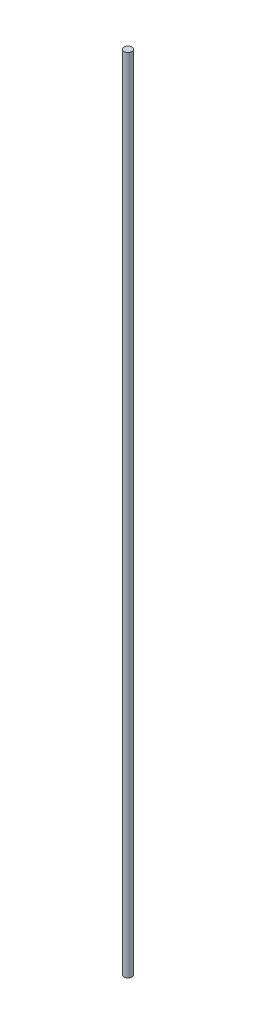
ISO-10303-21;
HEADER;
FILE_DESCRIPTION(('STEP AP214'),'2;1');
FILE_NAME('part.step','',(''),(''),'','','');
FILE_SCHEMA(('AUTOMOTIVE_DESIGN { 1 0 10303 214 1 1 1 1 }'));
ENDSEC;
DATA;
#1=APPLICATION_CONTEXT('core data for automotive mechanical design processes');
#2=APPLICATION_PROTOCOL_DEFINITION('international standard','automotive_design',2000,#1);
#3=PRODUCT_CONTEXT('',#1,'mechanical');
#4=PRODUCT('Part','Part','',(#3));
#5=PRODUCT_RELATED_PRODUCT_CATEGORY('part','',(#4));
#6=PRODUCT_DEFINITION_FORMATION('','',#4);
#7=PRODUCT_DEFINITION_CONTEXT('part definition',#1,'design');
#8=PRODUCT_DEFINITION('design','',#6,#7);
#9=PRODUCT_DEFINITION_SHAPE('','',#8);
#10=(LENGTH_UNIT() NAMED_UNIT(*) SI_UNIT(.MILLI.,.METRE.));
#11=(NAMED_UNIT(*) PLANE_ANGLE_UNIT() SI_UNIT($,.RADIAN.));
#12=(NAMED_UNIT(*) SI_UNIT($,.STERADIAN.) SOLID_ANGLE_UNIT());
#13=UNCERTAINTY_MEASURE_WITH_UNIT(LENGTH_MEASURE(1.E-05),#10,'distance_accuracy_value','');
#14=(GEOMETRIC_REPRESENTATION_CONTEXT(3) GLOBAL_UNCERTAINTY_ASSIGNED_CONTEXT((#13)) GLOBAL_UNIT_ASSIGNED_CONTEXT((#10,
#11,#12)) REPRESENTATION_CONTEXT('',''));
#15=CARTESIAN_POINT('',(0.,0.,0.));
#16=DIRECTION('',(0.,0.,1.));
#17=DIRECTION('',(1.,0.,0.));
#18=AXIS2_PLACEMENT_3D('',#15,#16,#17);
#19=CARTESIAN_POINT('',(0.,-400.,0.));
#20=DIRECTION('',(0.,1.,0.));
#21=DIRECTION('',(0.,0.,1.));
#22=AXIS2_PLACEMENT_3D('',#19,#20,#21);
#23=CYLINDRICAL_SURFACE('',#22,4.);
#24=CARTESIAN_POINT('',(0.,-400.,0.));
#25=DIRECTION('',(0.,1.,0.));
#26=DIRECTION('',(0.,0.,1.));
#27=AXIS2_PLACEMENT_3D('',#24,#25,#26);
#28=CIRCLE('',#27,4.);
#29=CARTESIAN_POINT('',(0.,-400.,4.));
#30=VERTEX_POINT('',#29);
#31=EDGE_CURVE('E10',#30,#30,#28,.T.);
#32=ORIENTED_EDGE('',*,*,#31,.T.);
#33=EDGE_LOOP('',(#32));
#34=FACE_BOUND('',#33,.T.);
#35=CARTESIAN_POINT('',(0.,415.,0.));
#36=DIRECTION('',(0.,1.,0.));
#37=DIRECTION('',(0.,0.,1.));
#38=AXIS2_PLACEMENT_3D('',#35,#36,#37);
#39=CIRCLE('',#38,4.);
#40=CARTESIAN_POINT('',(0.,415.,4.));
#41=VERTEX_POINT('',#40);
#42=EDGE_CURVE('E48',#41,#41,#39,.T.);
#43=ORIENTED_EDGE('',*,*,#42,.F.);
#44=EDGE_LOOP('',(#43));
#45=FACE_BOUND('',#44,.T.);
#46=ADVANCED_FACE('F41',(#34,#45),#23,.T.);
#47=CARTESIAN_POINT('',(0.,-400.,0.));
#48=DIRECTION('',(0.,1.,0.));
#49=DIRECTION('',(0.,0.,1.));
#50=AXIS2_PLACEMENT_3D('',#47,#48,#49);
#51=PLANE('',#50);
#52=ORIENTED_EDGE('',*,*,#31,.F.);
#53=EDGE_LOOP('',(#52));
#54=FACE_BOUND('',#53,.T.);
#55=ADVANCED_FACE('F58',(#54),#51,.F.);
#56=CARTESIAN_POINT('',(0.,415.,0.));
#57=DIRECTION('',(0.,1.,0.));
#58=DIRECTION('',(0.,0.,1.));
#59=AXIS2_PLACEMENT_3D('',#56,#57,#58);
#60=PLANE('',#59);
#61=ORIENTED_EDGE('',*,*,#42,.T.);
#62=EDGE_LOOP('',(#61));
#63=FACE_BOUND('',#62,.T.);
#64=ADVANCED_FACE('F55',(#63),#60,.T.);
#65=CLOSED_SHELL('',(#46,#55,#64));
#66=MANIFOLD_SOLID_BREP('B2',#65);
#67=ADVANCED_BREP_SHAPE_REPRESENTATION('',(#18,#66),#14);
#68=SHAPE_DEFINITION_REPRESENTATION(#9,#67);
ENDSEC;
END-ISO-10303-21;
